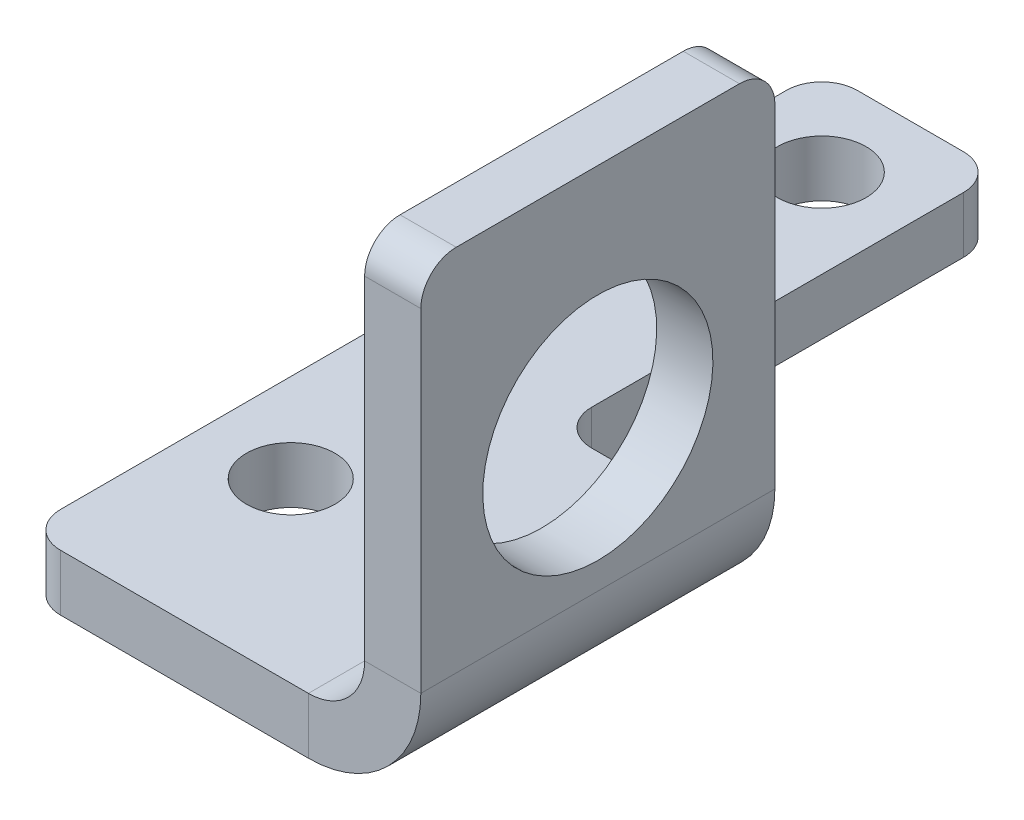
ISO-10303-21;
HEADER;
FILE_DESCRIPTION(('STEP AP214'),'2;1');
FILE_NAME('part.step','',(''),(''),'','','');
FILE_SCHEMA(('AUTOMOTIVE_DESIGN { 1 0 10303 214 1 1 1 1 }'));
ENDSEC;
DATA;
#1=APPLICATION_CONTEXT('core data for automotive mechanical design processes');
#2=APPLICATION_PROTOCOL_DEFINITION('international standard','automotive_design',2000,#1);
#3=PRODUCT_CONTEXT('',#1,'mechanical');
#4=PRODUCT('Part','Part','',(#3));
#5=PRODUCT_RELATED_PRODUCT_CATEGORY('part','',(#4));
#6=PRODUCT_DEFINITION_FORMATION('','',#4);
#7=PRODUCT_DEFINITION_CONTEXT('part definition',#1,'design');
#8=PRODUCT_DEFINITION('design','',#6,#7);
#9=PRODUCT_DEFINITION_SHAPE('','',#8);
#10=(LENGTH_UNIT() NAMED_UNIT(*) SI_UNIT(.MILLI.,.METRE.));
#11=(NAMED_UNIT(*) PLANE_ANGLE_UNIT() SI_UNIT($,.RADIAN.));
#12=(NAMED_UNIT(*) SI_UNIT($,.STERADIAN.) SOLID_ANGLE_UNIT());
#13=UNCERTAINTY_MEASURE_WITH_UNIT(LENGTH_MEASURE(1.E-05),#10,'distance_accuracy_value','');
#14=(GEOMETRIC_REPRESENTATION_CONTEXT(3) GLOBAL_UNCERTAINTY_ASSIGNED_CONTEXT((#13)) GLOBAL_UNIT_ASSIGNED_CONTEXT((#10,
#11,#12)) REPRESENTATION_CONTEXT('',''));
#15=CARTESIAN_POINT('',(0.,0.,0.));
#16=DIRECTION('',(0.,0.,1.));
#17=DIRECTION('',(1.,0.,0.));
#18=AXIS2_PLACEMENT_3D('',#15,#16,#17);
#19=CARTESIAN_POINT('',(10.,3.175,0.));
#20=DIRECTION('',(-1.,0.,0.));
#21=DIRECTION('',(0.,0.,-1.));
#22=AXIS2_PLACEMENT_3D('',#19,#20,#21);
#23=PLANE('',#22);
#24=DIRECTION('',(0.,0.,-1.));
#25=VECTOR('',#24,1.);
#26=CARTESIAN_POINT('',(10.,0.,0.));
#27=LINE('',#26,#25);
#28=CARTESIAN_POINT('',(10.,0.,-22.));
#29=VERTEX_POINT('',#28);
#30=CARTESIAN_POINT('',(10.,0.,-43.));
#31=VERTEX_POINT('',#30);
#32=EDGE_CURVE('E310',#29,#31,#27,.T.);
#33=ORIENTED_EDGE('',*,*,#32,.T.);
#34=DIRECTION('',(0.,-1.,0.));
#35=VECTOR('',#34,1.);
#36=CARTESIAN_POINT('',(10.,3.175,-43.));
#37=LINE('',#36,#35);
#38=CARTESIAN_POINT('',(10.,3.175,-43.));
#39=VERTEX_POINT('',#38);
#40=EDGE_CURVE('E351',#31,#39,#37,.F.);
#41=ORIENTED_EDGE('',*,*,#40,.T.);
#42=DIRECTION('',(0.,0.,-1.));
#43=VECTOR('',#42,1.);
#44=CARTESIAN_POINT('',(10.,3.175,0.));
#45=LINE('',#44,#43);
#46=CARTESIAN_POINT('',(10.,3.175,-22.));
#47=VERTEX_POINT('',#46);
#48=EDGE_CURVE('E286',#47,#39,#45,.T.);
#49=ORIENTED_EDGE('',*,*,#48,.F.);
#50=DIRECTION('',(0.,-1.,0.));
#51=VECTOR('',#50,1.);
#52=CARTESIAN_POINT('',(10.,0.,-22.));
#53=LINE('',#52,#51);
#54=EDGE_CURVE('E347',#47,#29,#53,.T.);
#55=ORIENTED_EDGE('',*,*,#54,.T.);
#56=EDGE_LOOP('',(#33,#41,#49,#55));
#57=FACE_BOUND('',#56,.T.);
#58=ADVANCED_FACE('F68',(#57),#23,.F.);
#59=CARTESIAN_POINT('',(0.,3.175,-45.));
#60=DIRECTION('',(0.,0.,1.));
#61=DIRECTION('',(-1.,0.,0.));
#62=AXIS2_PLACEMENT_3D('',#59,#60,#61);
#63=PLANE('',#62);
#64=DIRECTION('',(1.,0.,0.));
#65=VECTOR('',#64,1.);
#66=CARTESIAN_POINT('',(0.,0.,-45.));
#67=LINE('',#66,#65);
#68=CARTESIAN_POINT('',(8.,0.,-45.));
#69=VERTEX_POINT('',#68);
#70=CARTESIAN_POINT('',(2.,0.,-45.));
#71=VERTEX_POINT('',#70);
#72=EDGE_CURVE('E275',#69,#71,#67,.F.);
#73=ORIENTED_EDGE('',*,*,#72,.T.);
#74=DIRECTION('',(0.,-1.,0.));
#75=VECTOR('',#74,1.);
#76=CARTESIAN_POINT('',(2.,3.175,-45.));
#77=LINE('',#76,#75);
#78=CARTESIAN_POINT('',(2.,3.175,-45.));
#79=VERTEX_POINT('',#78);
#80=EDGE_CURVE('E318',#71,#79,#77,.F.);
#81=ORIENTED_EDGE('',*,*,#80,.T.);
#82=DIRECTION('',(-1.,0.,0.));
#83=VECTOR('',#82,1.);
#84=CARTESIAN_POINT('',(0.,3.175,-45.));
#85=LINE('',#84,#83);
#86=CARTESIAN_POINT('',(8.,3.175,-45.));
#87=VERTEX_POINT('',#86);
#88=EDGE_CURVE('E290',#87,#79,#85,.T.);
#89=ORIENTED_EDGE('',*,*,#88,.F.);
#90=DIRECTION('',(0.,-1.,0.));
#91=VECTOR('',#90,1.);
#92=CARTESIAN_POINT('',(8.,3.175,-45.));
#93=LINE('',#92,#91);
#94=EDGE_CURVE('E294',#87,#69,#93,.T.);
#95=ORIENTED_EDGE('',*,*,#94,.T.);
#96=EDGE_LOOP('',(#73,#81,#89,#95));
#97=FACE_BOUND('',#96,.T.);
#98=ADVANCED_FACE('F409',(#97),#63,.F.);
#99=CARTESIAN_POINT('',(0.,3.175,0.));
#100=DIRECTION('',(1.,0.,0.));
#101=DIRECTION('',(0.,0.,1.));
#102=AXIS2_PLACEMENT_3D('',#99,#100,#101);
#103=PLANE('',#102);
#104=DIRECTION('',(0.,0.,1.));
#105=VECTOR('',#104,1.);
#106=CARTESIAN_POINT('',(0.,3.175,0.));
#107=LINE('',#106,#105);
#108=CARTESIAN_POINT('',(0.,3.175,-43.));
#109=VERTEX_POINT('',#108);
#110=CARTESIAN_POINT('',(0.,3.175,-2.));
#111=VERTEX_POINT('',#110);
#112=EDGE_CURVE('E279',#109,#111,#107,.T.);
#113=ORIENTED_EDGE('',*,*,#112,.F.);
#114=DIRECTION('',(0.,-1.,0.));
#115=VECTOR('',#114,1.);
#116=CARTESIAN_POINT('',(0.,3.175,-43.));
#117=LINE('',#116,#115);
#118=CARTESIAN_POINT('',(0.,0.,-43.));
#119=VERTEX_POINT('',#118);
#120=EDGE_CURVE('E335',#109,#119,#117,.T.);
#121=ORIENTED_EDGE('',*,*,#120,.T.);
#122=DIRECTION('',(0.,0.,-1.));
#123=VECTOR('',#122,1.);
#124=CARTESIAN_POINT('',(0.,0.,0.));
#125=LINE('',#124,#123);
#126=CARTESIAN_POINT('',(0.,0.,-2.));
#127=VERTEX_POINT('',#126);
#128=EDGE_CURVE('E302',#119,#127,#125,.F.);
#129=ORIENTED_EDGE('',*,*,#128,.T.);
#130=DIRECTION('',(0.,-1.,0.));
#131=VECTOR('',#130,1.);
#132=CARTESIAN_POINT('',(0.,3.175,-2.));
#133=LINE('',#132,#131);
#134=EDGE_CURVE('E331',#127,#111,#133,.F.);
#135=ORIENTED_EDGE('',*,*,#134,.T.);
#136=EDGE_LOOP('',(#113,#121,#129,#135));
#137=FACE_BOUND('',#136,.T.);
#138=ADVANCED_FACE('F418',(#137),#103,.F.);
#139=CARTESIAN_POINT('',(5.,3.175,-10.));
#140=DIRECTION('',(0.,-1.,0.));
#141=DIRECTION('',(0.,0.,-1.));
#142=AXIS2_PLACEMENT_3D('',#139,#140,#141);
#143=CYLINDRICAL_SURFACE('',#142,2.5);
#144=CARTESIAN_POINT('',(5.,3.175,-10.));
#145=DIRECTION('',(0.,1.,0.));
#146=DIRECTION('',(0.,0.,1.));
#147=AXIS2_PLACEMENT_3D('',#144,#145,#146);
#148=CIRCLE('',#147,2.5);
#149=CARTESIAN_POINT('',(5.,3.175,-7.5));
#150=VERTEX_POINT('',#149);
#151=EDGE_CURVE('E270',#150,#150,#148,.T.);
#152=ORIENTED_EDGE('',*,*,#151,.T.);
#153=EDGE_LOOP('',(#152));
#154=FACE_BOUND('',#153,.T.);
#155=CARTESIAN_POINT('',(5.,0.,-10.));
#156=DIRECTION('',(0.,1.,0.));
#157=DIRECTION('',(0.,0.,1.));
#158=AXIS2_PLACEMENT_3D('',#155,#156,#157);
#159=CIRCLE('',#158,2.5);
#160=CARTESIAN_POINT('',(5.,0.,-7.5));
#161=VERTEX_POINT('',#160);
#162=EDGE_CURVE('E269',#161,#161,#159,.T.);
#163=ORIENTED_EDGE('',*,*,#162,.F.);
#164=EDGE_LOOP('',(#163));
#165=FACE_BOUND('',#164,.T.);
#166=ADVANCED_FACE('F663',(#154,#165),#143,.F.);
#167=CARTESIAN_POINT('',(5.,3.175,-40.));
#168=DIRECTION('',(0.,-1.,0.));
#169=DIRECTION('',(0.,0.,-1.));
#170=AXIS2_PLACEMENT_3D('',#167,#168,#169);
#171=CYLINDRICAL_SURFACE('',#170,2.5);
#172=CARTESIAN_POINT('',(5.,3.175,-40.));
#173=DIRECTION('',(0.,1.,0.));
#174=DIRECTION('',(0.,0.,1.));
#175=AXIS2_PLACEMENT_3D('',#172,#173,#174);
#176=CIRCLE('',#175,2.5);
#177=CARTESIAN_POINT('',(5.,3.175,-37.5));
#178=VERTEX_POINT('',#177);
#179=EDGE_CURVE('E274',#178,#178,#176,.T.);
#180=ORIENTED_EDGE('',*,*,#179,.T.);
#181=EDGE_LOOP('',(#180));
#182=FACE_BOUND('',#181,.T.);
#183=CARTESIAN_POINT('',(5.,0.,-40.));
#184=DIRECTION('',(0.,1.,0.));
#185=DIRECTION('',(0.,0.,1.));
#186=AXIS2_PLACEMENT_3D('',#183,#184,#185);
#187=CIRCLE('',#186,2.5);
#188=CARTESIAN_POINT('',(5.,0.,-37.5));
#189=VERTEX_POINT('',#188);
#190=EDGE_CURVE('E298',#189,#189,#187,.T.);
#191=ORIENTED_EDGE('',*,*,#190,.F.);
#192=EDGE_LOOP('',(#191));
#193=FACE_BOUND('',#192,.T.);
#194=ADVANCED_FACE('F485',(#182,#193),#171,.F.);
#195=CARTESIAN_POINT('',(0.,3.175,0.));
#196=DIRECTION('',(0.,0.,-1.));
#197=DIRECTION('',(1.,0.,0.));
#198=AXIS2_PLACEMENT_3D('',#195,#196,#197);
#199=PLANE('',#198);
#200=DIRECTION('',(1.,0.,0.));
#201=VECTOR('',#200,1.);
#202=CARTESIAN_POINT('',(0.,3.175,0.));
#203=LINE('',#202,#201);
#204=CARTESIAN_POINT('',(2.,3.175,0.));
#205=VERTEX_POINT('',#204);
#206=CARTESIAN_POINT('',(16.,3.175,0.));
#207=VERTEX_POINT('',#206);
#208=EDGE_CURVE('E283',#205,#207,#203,.T.);
#209=ORIENTED_EDGE('',*,*,#208,.F.);
#210=DIRECTION('',(0.,-1.,0.));
#211=VECTOR('',#210,1.);
#212=CARTESIAN_POINT('',(2.,3.175,0.));
#213=LINE('',#212,#211);
#214=CARTESIAN_POINT('',(2.,0.,0.));
#215=VERTEX_POINT('',#214);
#216=EDGE_CURVE('E382',#205,#215,#213,.T.);
#217=ORIENTED_EDGE('',*,*,#216,.T.);
#218=DIRECTION('',(1.,0.,0.));
#219=VECTOR('',#218,1.);
#220=CARTESIAN_POINT('',(0.,0.,0.));
#221=LINE('',#220,#219);
#222=CARTESIAN_POINT('',(16.,0.,0.));
#223=VERTEX_POINT('',#222);
#224=EDGE_CURVE('E306',#215,#223,#221,.T.);
#225=ORIENTED_EDGE('',*,*,#224,.T.);
#226=DIRECTION('',(0.,-1.,0.));
#227=VECTOR('',#226,1.);
#228=CARTESIAN_POINT('',(16.,3.175,0.));
#229=LINE('',#228,#227);
#230=EDGE_CURVE('E254',#207,#223,#229,.T.);
#231=ORIENTED_EDGE('',*,*,#230,.F.);
#232=EDGE_LOOP('',(#209,#217,#225,#231));
#233=FACE_BOUND('',#232,.T.);
#234=ADVANCED_FACE('F426',(#233),#199,.F.);
#235=CARTESIAN_POINT('',(0.,3.175,0.));
#236=DIRECTION('',(0.,-1.,0.));
#237=DIRECTION('',(0.,0.,-1.));
#238=AXIS2_PLACEMENT_3D('',#235,#236,#237);
#239=PLANE('',#238);
#240=ORIENTED_EDGE('',*,*,#151,.F.);
#241=EDGE_LOOP('',(#240));
#242=FACE_BOUND('',#241,.T.);
#243=ORIENTED_EDGE('',*,*,#179,.F.);
#244=EDGE_LOOP('',(#243));
#245=FACE_BOUND('',#244,.T.);
#246=ORIENTED_EDGE('',*,*,#88,.T.);
#247=CARTESIAN_POINT('',(2.,3.175,-43.));
#248=DIRECTION('',(0.,-1.,0.));
#249=DIRECTION('',(0.,0.,-1.));
#250=AXIS2_PLACEMENT_3D('',#247,#248,#249);
#251=CIRCLE('',#250,2.);
#252=EDGE_CURVE('E328',#79,#109,#251,.F.);
#253=ORIENTED_EDGE('',*,*,#252,.T.);
#254=ORIENTED_EDGE('',*,*,#112,.T.);
#255=CARTESIAN_POINT('',(2.,3.175,-2.));
#256=DIRECTION('',(0.,-1.,0.));
#257=DIRECTION('',(0.,0.,-1.));
#258=AXIS2_PLACEMENT_3D('',#255,#256,#257);
#259=CIRCLE('',#258,2.);
#260=EDGE_CURVE('E322',#111,#205,#259,.F.);
#261=ORIENTED_EDGE('',*,*,#260,.T.);
#262=ORIENTED_EDGE('',*,*,#208,.T.);
#263=DIRECTION('',(0.,0.,-1.));
#264=VECTOR('',#263,1.);
#265=CARTESIAN_POINT('',(16.,3.175,-20.));
#266=LINE('',#265,#264);
#267=CARTESIAN_POINT('',(16.,3.175,-20.));
#268=VERTEX_POINT('',#267);
#269=EDGE_CURVE('E248',#268,#207,#266,.F.);
#270=ORIENTED_EDGE('',*,*,#269,.F.);
#271=DIRECTION('',(-1.,0.,0.));
#272=VECTOR('',#271,1.);
#273=CARTESIAN_POINT('',(16.,3.175,-20.));
#274=LINE('',#273,#272);
#275=CARTESIAN_POINT('',(12.,3.175,-20.));
#276=VERTEX_POINT('',#275);
#277=EDGE_CURVE('E265',#268,#276,#274,.T.);
#278=ORIENTED_EDGE('',*,*,#277,.T.);
#279=CARTESIAN_POINT('',(12.,3.175,-22.));
#280=DIRECTION('',(0.,-1.,0.));
#281=DIRECTION('',(0.,0.,-1.));
#282=AXIS2_PLACEMENT_3D('',#279,#280,#281);
#283=CIRCLE('',#282,2.);
#284=EDGE_CURVE('E13',#276,#47,#283,.T.);
#285=ORIENTED_EDGE('',*,*,#284,.T.);
#286=ORIENTED_EDGE('',*,*,#48,.T.);
#287=CARTESIAN_POINT('',(8.,3.175,-43.));
#288=DIRECTION('',(0.,-1.,0.));
#289=DIRECTION('',(0.,0.,-1.));
#290=AXIS2_PLACEMENT_3D('',#287,#288,#289);
#291=CIRCLE('',#290,2.);
#292=EDGE_CURVE('E325',#39,#87,#291,.F.);
#293=ORIENTED_EDGE('',*,*,#292,.T.);
#294=EDGE_LOOP('',(#246,#253,#254,#261,#262,#270,#278,#285,#286,#293));
#295=FACE_BOUND('',#294,.T.);
#296=ADVANCED_FACE('F399',(#242,#245,#295),#239,.F.);
#297=CARTESIAN_POINT('',(0.,0.,0.));
#298=DIRECTION('',(0.,-1.,0.));
#299=DIRECTION('',(0.,0.,-1.));
#300=AXIS2_PLACEMENT_3D('',#297,#298,#299);
#301=PLANE('',#300);
#302=ORIENTED_EDGE('',*,*,#162,.T.);
#303=EDGE_LOOP('',(#302));
#304=FACE_BOUND('',#303,.T.);
#305=ORIENTED_EDGE('',*,*,#190,.T.);
#306=EDGE_LOOP('',(#305));
#307=FACE_BOUND('',#306,.T.);
#308=ORIENTED_EDGE('',*,*,#128,.F.);
#309=CARTESIAN_POINT('',(2.,0.,-43.));
#310=DIRECTION('',(0.,-1.,0.));
#311=DIRECTION('',(0.,0.,-1.));
#312=AXIS2_PLACEMENT_3D('',#309,#310,#311);
#313=CIRCLE('',#312,2.);
#314=EDGE_CURVE('E344',#119,#71,#313,.T.);
#315=ORIENTED_EDGE('',*,*,#314,.T.);
#316=ORIENTED_EDGE('',*,*,#72,.F.);
#317=CARTESIAN_POINT('',(8.,0.,-43.));
#318=DIRECTION('',(0.,-1.,0.));
#319=DIRECTION('',(0.,0.,-1.));
#320=AXIS2_PLACEMENT_3D('',#317,#318,#319);
#321=CIRCLE('',#320,2.);
#322=EDGE_CURVE('E341',#69,#31,#321,.T.);
#323=ORIENTED_EDGE('',*,*,#322,.T.);
#324=ORIENTED_EDGE('',*,*,#32,.F.);
#325=CARTESIAN_POINT('',(12.,0.,-22.));
#326=DIRECTION('',(0.,-1.,0.));
#327=DIRECTION('',(0.,0.,-1.));
#328=AXIS2_PLACEMENT_3D('',#325,#326,#327);
#329=CIRCLE('',#328,2.);
#330=CARTESIAN_POINT('',(12.,0.,-20.));
#331=VERTEX_POINT('',#330);
#332=EDGE_CURVE('E77',#29,#331,#329,.F.);
#333=ORIENTED_EDGE('',*,*,#332,.T.);
#334=DIRECTION('',(-1.,0.,0.));
#335=VECTOR('',#334,1.);
#336=CARTESIAN_POINT('',(16.,0.,-20.));
#337=LINE('',#336,#335);
#338=CARTESIAN_POINT('',(16.,0.,-20.));
#339=VERTEX_POINT('',#338);
#340=EDGE_CURVE('E258',#339,#331,#337,.T.);
#341=ORIENTED_EDGE('',*,*,#340,.F.);
#342=DIRECTION('',(0.,0.,-1.));
#343=VECTOR('',#342,1.);
#344=CARTESIAN_POINT('',(16.,0.,-20.));
#345=LINE('',#344,#343);
#346=EDGE_CURVE('E192',#339,#223,#345,.F.);
#347=ORIENTED_EDGE('',*,*,#346,.T.);
#348=ORIENTED_EDGE('',*,*,#224,.F.);
#349=CARTESIAN_POINT('',(2.,0.,-2.));
#350=DIRECTION('',(0.,-1.,0.));
#351=DIRECTION('',(0.,0.,-1.));
#352=AXIS2_PLACEMENT_3D('',#349,#350,#351);
#353=CIRCLE('',#352,2.);
#354=EDGE_CURVE('E338',#215,#127,#353,.T.);
#355=ORIENTED_EDGE('',*,*,#354,.T.);
#356=EDGE_LOOP('',(#308,#315,#316,#323,#324,#333,#341,#347,#348,#355));
#357=FACE_BOUND('',#356,.T.);
#358=ADVANCED_FACE('F388',(#304,#307,#357),#301,.T.);
#359=CARTESIAN_POINT('',(16.,3.175,-20.));
#360=DIRECTION('',(0.,0.,-1.));
#361=DIRECTION('',(0.,-1.,0.));
#362=AXIS2_PLACEMENT_3D('',#359,#360,#361);
#363=PLANE('',#362);
#364=ORIENTED_EDGE('',*,*,#340,.T.);
#365=DIRECTION('',(0.,1.,0.));
#366=VECTOR('',#365,1.);
#367=CARTESIAN_POINT('',(12.,3.175,-20.));
#368=LINE('',#367,#366);
#369=EDGE_CURVE('E355',#331,#276,#368,.T.);
#370=ORIENTED_EDGE('',*,*,#369,.T.);
#371=ORIENTED_EDGE('',*,*,#277,.F.);
#372=DIRECTION('',(0.,-1.,0.));
#373=VECTOR('',#372,1.);
#374=CARTESIAN_POINT('',(16.,3.175,-20.));
#375=LINE('',#374,#373);
#376=EDGE_CURVE('E243',#268,#339,#375,.T.);
#377=ORIENTED_EDGE('',*,*,#376,.T.);
#378=EDGE_LOOP('',(#364,#370,#371,#377));
#379=FACE_BOUND('',#378,.T.);
#380=ADVANCED_FACE('F393',(#379),#363,.T.);
#381=CARTESIAN_POINT('',(16.,6.35,0.));
#382=DIRECTION('',(0.,0.,1.));
#383=DIRECTION('',(0.,-1.,0.));
#384=AXIS2_PLACEMENT_3D('',#381,#382,#383);
#385=PLANE('',#384);
#386=DIRECTION('',(-1.,0.,0.));
#387=VECTOR('',#386,1.);
#388=CARTESIAN_POINT('',(22.35,6.34999999999998,0.));
#389=LINE('',#388,#387);
#390=CARTESIAN_POINT('',(19.175,6.34999999999999,0.));
#391=VERTEX_POINT('',#390);
#392=CARTESIAN_POINT('',(22.35,6.34999999999997,0.));
#393=VERTEX_POINT('',#392);
#394=EDGE_CURVE('E234',#391,#393,#389,.F.);
#395=ORIENTED_EDGE('',*,*,#394,.F.);
#396=CARTESIAN_POINT('',(16.,6.35,0.));
#397=DIRECTION('',(0.,0.,-1.));
#398=DIRECTION('',(0.,1.,0.));
#399=AXIS2_PLACEMENT_3D('',#396,#397,#398);
#400=CIRCLE('',#399,3.175);
#401=EDGE_CURVE('E196',#207,#391,#400,.F.);
#402=ORIENTED_EDGE('',*,*,#401,.F.);
#403=ORIENTED_EDGE('',*,*,#230,.T.);
#404=CARTESIAN_POINT('',(16.,6.35,0.));
#405=DIRECTION('',(0.,0.,-1.));
#406=DIRECTION('',(0.,1.,0.));
#407=AXIS2_PLACEMENT_3D('',#404,#405,#406);
#408=CIRCLE('',#407,6.35);
#409=EDGE_CURVE('E241',#223,#393,#408,.F.);
#410=ORIENTED_EDGE('',*,*,#409,.T.);
#411=EDGE_LOOP('',(#395,#402,#403,#410));
#412=FACE_BOUND('',#411,.T.);
#413=ADVANCED_FACE('F431',(#412),#385,.T.);
#414=CARTESIAN_POINT('',(16.,6.35,-20.));
#415=DIRECTION('',(0.,0.,1.));
#416=DIRECTION('',(0.,-1.,0.));
#417=AXIS2_PLACEMENT_3D('',#414,#415,#416);
#418=PLANE('',#417);
#419=CARTESIAN_POINT('',(16.,6.35,-20.));
#420=DIRECTION('',(0.,0.,-1.));
#421=DIRECTION('',(0.,1.,0.));
#422=AXIS2_PLACEMENT_3D('',#419,#420,#421);
#423=CIRCLE('',#422,3.175);
#424=CARTESIAN_POINT('',(19.175,6.34999999999999,-20.));
#425=VERTEX_POINT('',#424);
#426=EDGE_CURVE('E203',#425,#268,#423,.T.);
#427=ORIENTED_EDGE('',*,*,#426,.F.);
#428=DIRECTION('',(-1.,0.,0.));
#429=VECTOR('',#428,1.);
#430=CARTESIAN_POINT('',(19.175,6.34999999999999,-20.));
#431=LINE('',#430,#429);
#432=CARTESIAN_POINT('',(22.35,6.34999999999998,-20.));
#433=VERTEX_POINT('',#432);
#434=EDGE_CURVE('E200',#425,#433,#431,.F.);
#435=ORIENTED_EDGE('',*,*,#434,.T.);
#436=CARTESIAN_POINT('',(16.,6.35,-20.));
#437=DIRECTION('',(0.,0.,-1.));
#438=DIRECTION('',(0.,1.,0.));
#439=AXIS2_PLACEMENT_3D('',#436,#437,#438);
#440=CIRCLE('',#439,6.35);
#441=EDGE_CURVE('E184',#433,#339,#440,.T.);
#442=ORIENTED_EDGE('',*,*,#441,.T.);
#443=ORIENTED_EDGE('',*,*,#376,.F.);
#444=EDGE_LOOP('',(#427,#435,#442,#443));
#445=FACE_BOUND('',#444,.T.);
#446=ADVANCED_FACE('F201',(#445),#418,.F.);
#447=CARTESIAN_POINT('',(16.,6.35,-20.));
#448=DIRECTION('',(0.,0.,-1.));
#449=DIRECTION('',(1.,0.,0.));
#450=AXIS2_PLACEMENT_3D('',#447,#448,#449);
#451=CYLINDRICAL_SURFACE('',#450,6.35);
#452=ORIENTED_EDGE('',*,*,#346,.F.);
#453=ORIENTED_EDGE('',*,*,#441,.F.);
#454=DIRECTION('',(0.,0.,-1.));
#455=VECTOR('',#454,1.);
#456=CARTESIAN_POINT('',(22.35,6.34999999999998,0.));
#457=LINE('',#456,#455);
#458=EDGE_CURVE('E189',#433,#393,#457,.F.);
#459=ORIENTED_EDGE('',*,*,#458,.T.);
#460=ORIENTED_EDGE('',*,*,#409,.F.);
#461=EDGE_LOOP('',(#452,#453,#459,#460));
#462=FACE_BOUND('',#461,.T.);
#463=ADVANCED_FACE('F186',(#462),#451,.T.);
#464=CARTESIAN_POINT('',(16.,6.35,-20.));
#465=DIRECTION('',(0.,0.,-1.));
#466=DIRECTION('',(1.,0.,0.));
#467=AXIS2_PLACEMENT_3D('',#464,#465,#466);
#468=CYLINDRICAL_SURFACE('',#467,3.175);
#469=ORIENTED_EDGE('',*,*,#269,.T.);
#470=ORIENTED_EDGE('',*,*,#401,.T.);
#471=DIRECTION('',(0.,0.,-1.));
#472=VECTOR('',#471,1.);
#473=CARTESIAN_POINT('',(19.175,6.34999999999999,0.));
#474=LINE('',#473,#472);
#475=EDGE_CURVE('E206',#391,#425,#474,.T.);
#476=ORIENTED_EDGE('',*,*,#475,.T.);
#477=ORIENTED_EDGE('',*,*,#426,.T.);
#478=EDGE_LOOP('',(#469,#470,#476,#477));
#479=FACE_BOUND('',#478,.T.);
#480=ADVANCED_FACE('F434',(#479),#468,.F.);
#481=CARTESIAN_POINT('',(22.3500000000001,27.175,-20.));
#482=DIRECTION('',(0.,0.,1.));
#483=DIRECTION('',(0.,-1.,0.));
#484=AXIS2_PLACEMENT_3D('',#481,#482,#483);
#485=PLANE('',#484);
#486=DIRECTION('',(0.,-1.,0.));
#487=VECTOR('',#486,1.);
#488=CARTESIAN_POINT('',(19.1750000000001,27.175,-20.));
#489=LINE('',#488,#487);
#490=CARTESIAN_POINT('',(19.1750000000001,25.175,-20.));
#491=VERTEX_POINT('',#490);
#492=EDGE_CURVE('E213',#425,#491,#489,.F.);
#493=ORIENTED_EDGE('',*,*,#492,.T.);
#494=DIRECTION('',(-1.,0.,0.));
#495=VECTOR('',#494,1.);
#496=CARTESIAN_POINT('',(22.3500000000001,25.175,-20.));
#497=LINE('',#496,#495);
#498=CARTESIAN_POINT('',(22.3500000000001,25.175,-20.));
#499=VERTEX_POINT('',#498);
#500=EDGE_CURVE('E92',#491,#499,#497,.F.);
#501=ORIENTED_EDGE('',*,*,#500,.T.);
#502=DIRECTION('',(0.,1.,0.));
#503=VECTOR('',#502,1.);
#504=CARTESIAN_POINT('',(22.35,0.,-20.));
#505=LINE('',#504,#503);
#506=EDGE_CURVE('E209',#433,#499,#505,.T.);
#507=ORIENTED_EDGE('',*,*,#506,.F.);
#508=ORIENTED_EDGE('',*,*,#434,.F.);
#509=EDGE_LOOP('',(#493,#501,#507,#508));
#510=FACE_BOUND('',#509,.T.);
#511=ADVANCED_FACE('F215',(#510),#485,.F.);
#512=CARTESIAN_POINT('',(22.35,3.17499999999999,0.));
#513=DIRECTION('',(0.,0.,-1.));
#514=DIRECTION('',(-1.,0.,0.));
#515=AXIS2_PLACEMENT_3D('',#512,#513,#514);
#516=PLANE('',#515);
#517=DIRECTION('',(0.,-1.,0.));
#518=VECTOR('',#517,1.);
#519=CARTESIAN_POINT('',(22.35,0.,0.));
#520=LINE('',#519,#518);
#521=CARTESIAN_POINT('',(22.3500000000001,25.175,0.));
#522=VERTEX_POINT('',#521);
#523=EDGE_CURVE('E211',#522,#393,#520,.T.);
#524=ORIENTED_EDGE('',*,*,#523,.F.);
#525=DIRECTION('',(-1.,0.,0.));
#526=VECTOR('',#525,1.);
#527=CARTESIAN_POINT('',(22.3500000000001,25.175,0.));
#528=LINE('',#527,#526);
#529=CARTESIAN_POINT('',(19.1750000000001,25.175,0.));
#530=VERTEX_POINT('',#529);
#531=EDGE_CURVE('E378',#522,#530,#528,.T.);
#532=ORIENTED_EDGE('',*,*,#531,.T.);
#533=DIRECTION('',(0.,1.,0.));
#534=VECTOR('',#533,1.);
#535=CARTESIAN_POINT('',(19.175,3.175,0.));
#536=LINE('',#535,#534);
#537=EDGE_CURVE('E218',#530,#391,#536,.F.);
#538=ORIENTED_EDGE('',*,*,#537,.T.);
#539=ORIENTED_EDGE('',*,*,#394,.T.);
#540=EDGE_LOOP('',(#524,#532,#538,#539));
#541=FACE_BOUND('',#540,.T.);
#542=ADVANCED_FACE('F450',(#541),#516,.F.);
#543=CARTESIAN_POINT('',(22.35,0.,0.));
#544=DIRECTION('',(-1.,0.,0.));
#545=DIRECTION('',(0.,-1.,0.));
#546=AXIS2_PLACEMENT_3D('',#543,#544,#545);
#547=PLANE('',#546);
#548=CARTESIAN_POINT('',(22.35,14.3499999999999,-10.));
#549=DIRECTION('',(-1.,0.,0.));
#550=DIRECTION('',(0.,-1.,0.));
#551=AXIS2_PLACEMENT_3D('',#548,#549,#550);
#552=CIRCLE('',#551,6.5);
#553=CARTESIAN_POINT('',(22.35,7.84999999999992,-10.));
#554=VERTEX_POINT('',#553);
#555=EDGE_CURVE('E238',#554,#554,#552,.F.);
#556=ORIENTED_EDGE('',*,*,#555,.F.);
#557=EDGE_LOOP('',(#556));
#558=FACE_BOUND('',#557,.T.);
#559=ORIENTED_EDGE('',*,*,#506,.T.);
#560=CARTESIAN_POINT('',(22.3500000000001,25.175,-18.));
#561=DIRECTION('',(-1.,0.,0.));
#562=DIRECTION('',(0.,-1.,0.));
#563=AXIS2_PLACEMENT_3D('',#560,#561,#562);
#564=CIRCLE('',#563,2.);
#565=CARTESIAN_POINT('',(22.3500000000001,27.175,-18.));
#566=VERTEX_POINT('',#565);
#567=EDGE_CURVE('E375',#499,#566,#564,.F.);
#568=ORIENTED_EDGE('',*,*,#567,.T.);
#569=DIRECTION('',(0.,0.,1.));
#570=VECTOR('',#569,1.);
#571=CARTESIAN_POINT('',(22.3500000000001,27.175,0.));
#572=LINE('',#571,#570);
#573=CARTESIAN_POINT('',(22.3500000000001,27.175,-2.));
#574=VERTEX_POINT('',#573);
#575=EDGE_CURVE('E217',#566,#574,#572,.T.);
#576=ORIENTED_EDGE('',*,*,#575,.T.);
#577=CARTESIAN_POINT('',(22.3500000000001,25.175,-2.));
#578=DIRECTION('',(-1.,0.,0.));
#579=DIRECTION('',(0.,-1.,0.));
#580=AXIS2_PLACEMENT_3D('',#577,#578,#579);
#581=CIRCLE('',#580,2.);
#582=EDGE_CURVE('E84',#574,#522,#581,.F.);
#583=ORIENTED_EDGE('',*,*,#582,.T.);
#584=ORIENTED_EDGE('',*,*,#523,.T.);
#585=ORIENTED_EDGE('',*,*,#458,.F.);
#586=EDGE_LOOP('',(#559,#568,#576,#583,#584,#585));
#587=FACE_BOUND('',#586,.T.);
#588=ADVANCED_FACE('F208',(#558,#587),#547,.F.);
#589=CARTESIAN_POINT('',(19.175,0.,0.));
#590=DIRECTION('',(-1.,0.,0.));
#591=DIRECTION('',(0.,-1.,0.));
#592=AXIS2_PLACEMENT_3D('',#589,#590,#591);
#593=PLANE('',#592);
#594=CARTESIAN_POINT('',(19.175,14.3499999999999,-10.));
#595=DIRECTION('',(-1.,0.,0.));
#596=DIRECTION('',(0.,-1.,0.));
#597=AXIS2_PLACEMENT_3D('',#594,#595,#596);
#598=CIRCLE('',#597,6.5);
#599=CARTESIAN_POINT('',(19.175,7.84999999999993,-10.));
#600=VERTEX_POINT('',#599);
#601=EDGE_CURVE('E456',#600,#600,#598,.T.);
#602=ORIENTED_EDGE('',*,*,#601,.F.);
#603=EDGE_LOOP('',(#602));
#604=FACE_BOUND('',#603,.T.);
#605=DIRECTION('',(0.,0.,-1.));
#606=VECTOR('',#605,1.);
#607=CARTESIAN_POINT('',(19.1750000000001,27.175,0.));
#608=LINE('',#607,#606);
#609=CARTESIAN_POINT('',(19.1750000000001,27.175,-18.));
#610=VERTEX_POINT('',#609);
#611=CARTESIAN_POINT('',(19.1750000000001,27.175,-2.));
#612=VERTEX_POINT('',#611);
#613=EDGE_CURVE('E223',#610,#612,#608,.F.);
#614=ORIENTED_EDGE('',*,*,#613,.F.);
#615=CARTESIAN_POINT('',(19.1750000000001,25.175,-18.));
#616=DIRECTION('',(-1.,0.,0.));
#617=DIRECTION('',(0.,-1.,0.));
#618=AXIS2_PLACEMENT_3D('',#615,#616,#617);
#619=CIRCLE('',#618,2.);
#620=EDGE_CURVE('E368',#610,#491,#619,.T.);
#621=ORIENTED_EDGE('',*,*,#620,.T.);
#622=ORIENTED_EDGE('',*,*,#492,.F.);
#623=ORIENTED_EDGE('',*,*,#475,.F.);
#624=ORIENTED_EDGE('',*,*,#537,.F.);
#625=CARTESIAN_POINT('',(19.1750000000001,25.175,-2.));
#626=DIRECTION('',(-1.,0.,0.));
#627=DIRECTION('',(0.,-1.,0.));
#628=AXIS2_PLACEMENT_3D('',#625,#626,#627);
#629=CIRCLE('',#628,2.);
#630=EDGE_CURVE('E365',#530,#612,#629,.T.);
#631=ORIENTED_EDGE('',*,*,#630,.T.);
#632=EDGE_LOOP('',(#614,#621,#622,#623,#624,#631));
#633=FACE_BOUND('',#632,.T.);
#634=ADVANCED_FACE('F438',(#604,#633),#593,.T.);
#635=CARTESIAN_POINT('',(22.3500000000001,27.175,0.));
#636=DIRECTION('',(0.,-1.,0.));
#637=DIRECTION('',(1.,0.,0.));
#638=AXIS2_PLACEMENT_3D('',#635,#636,#637);
#639=PLANE('',#638);
#640=ORIENTED_EDGE('',*,*,#575,.F.);
#641=DIRECTION('',(-1.,0.,0.));
#642=VECTOR('',#641,1.);
#643=CARTESIAN_POINT('',(22.3500000000001,27.175,-18.));
#644=LINE('',#643,#642);
#645=EDGE_CURVE('E361',#566,#610,#644,.T.);
#646=ORIENTED_EDGE('',*,*,#645,.T.);
#647=ORIENTED_EDGE('',*,*,#613,.T.);
#648=DIRECTION('',(-1.,0.,0.));
#649=VECTOR('',#648,1.);
#650=CARTESIAN_POINT('',(22.3500000000001,27.175,-2.));
#651=LINE('',#650,#649);
#652=EDGE_CURVE('E358',#612,#574,#651,.F.);
#653=ORIENTED_EDGE('',*,*,#652,.T.);
#654=EDGE_LOOP('',(#640,#646,#647,#653));
#655=FACE_BOUND('',#654,.T.);
#656=ADVANCED_FACE('F444',(#655),#639,.F.);
#657=CARTESIAN_POINT('',(22.3510000000001,14.3499999999999,-10.));
#658=DIRECTION('',(-1.,0.,0.));
#659=DIRECTION('',(0.,-1.,0.));
#660=AXIS2_PLACEMENT_3D('',#657,#658,#659);
#661=CYLINDRICAL_SURFACE('',#660,6.5);
#662=ORIENTED_EDGE('',*,*,#601,.T.);
#663=EDGE_LOOP('',(#662));
#664=FACE_BOUND('',#663,.T.);
#665=ORIENTED_EDGE('',*,*,#555,.T.);
#666=EDGE_LOOP('',(#665));
#667=FACE_BOUND('',#666,.T.);
#668=ADVANCED_FACE('F461',(#664,#667),#661,.F.);
#669=CARTESIAN_POINT('',(2.,3.175,-43.));
#670=DIRECTION('',(0.,1.,0.));
#671=DIRECTION('',(0.,0.,1.));
#672=AXIS2_PLACEMENT_3D('',#669,#670,#671);
#673=CYLINDRICAL_SURFACE('',#672,2.);
#674=ORIENTED_EDGE('',*,*,#314,.F.);
#675=ORIENTED_EDGE('',*,*,#120,.F.);
#676=ORIENTED_EDGE('',*,*,#252,.F.);
#677=ORIENTED_EDGE('',*,*,#80,.F.);
#678=EDGE_LOOP('',(#674,#675,#676,#677));
#679=FACE_BOUND('',#678,.T.);
#680=ADVANCED_FACE('F414',(#679),#673,.T.);
#681=CARTESIAN_POINT('',(8.,3.175,-43.));
#682=DIRECTION('',(0.,1.,0.));
#683=DIRECTION('',(0.,0.,1.));
#684=AXIS2_PLACEMENT_3D('',#681,#682,#683);
#685=CYLINDRICAL_SURFACE('',#684,2.);
#686=ORIENTED_EDGE('',*,*,#322,.F.);
#687=ORIENTED_EDGE('',*,*,#94,.F.);
#688=ORIENTED_EDGE('',*,*,#292,.F.);
#689=ORIENTED_EDGE('',*,*,#40,.F.);
#690=EDGE_LOOP('',(#686,#687,#688,#689));
#691=FACE_BOUND('',#690,.T.);
#692=ADVANCED_FACE('F405',(#691),#685,.T.);
#693=CARTESIAN_POINT('',(12.,3.175,-22.));
#694=DIRECTION('',(0.,-1.,0.));
#695=DIRECTION('',(0.,0.,-1.));
#696=AXIS2_PLACEMENT_3D('',#693,#694,#695);
#697=CYLINDRICAL_SURFACE('',#696,2.);
#698=ORIENTED_EDGE('',*,*,#284,.F.);
#699=ORIENTED_EDGE('',*,*,#369,.F.);
#700=ORIENTED_EDGE('',*,*,#332,.F.);
#701=ORIENTED_EDGE('',*,*,#54,.F.);
#702=EDGE_LOOP('',(#698,#699,#700,#701));
#703=FACE_BOUND('',#702,.T.);
#704=ADVANCED_FACE('F396',(#703),#697,.F.);
#705=CARTESIAN_POINT('',(22.3500000000001,25.175,-18.));
#706=DIRECTION('',(-1.,0.,0.));
#707=DIRECTION('',(0.,-1.,0.));
#708=AXIS2_PLACEMENT_3D('',#705,#706,#707);
#709=CYLINDRICAL_SURFACE('',#708,2.);
#710=ORIENTED_EDGE('',*,*,#567,.F.);
#711=ORIENTED_EDGE('',*,*,#500,.F.);
#712=ORIENTED_EDGE('',*,*,#620,.F.);
#713=ORIENTED_EDGE('',*,*,#645,.F.);
#714=EDGE_LOOP('',(#710,#711,#712,#713));
#715=FACE_BOUND('',#714,.T.);
#716=ADVANCED_FACE('F440',(#715),#709,.T.);
#717=CARTESIAN_POINT('',(22.3500000000001,25.175,-2.));
#718=DIRECTION('',(-1.,0.,0.));
#719=DIRECTION('',(0.,-1.,0.));
#720=AXIS2_PLACEMENT_3D('',#717,#718,#719);
#721=CYLINDRICAL_SURFACE('',#720,2.);
#722=ORIENTED_EDGE('',*,*,#582,.F.);
#723=ORIENTED_EDGE('',*,*,#652,.F.);
#724=ORIENTED_EDGE('',*,*,#630,.F.);
#725=ORIENTED_EDGE('',*,*,#531,.F.);
#726=EDGE_LOOP('',(#722,#723,#724,#725));
#727=FACE_BOUND('',#726,.T.);
#728=ADVANCED_FACE('F447',(#727),#721,.T.);
#729=CARTESIAN_POINT('',(2.,3.175,-2.));
#730=DIRECTION('',(0.,1.,0.));
#731=DIRECTION('',(0.,0.,1.));
#732=AXIS2_PLACEMENT_3D('',#729,#730,#731);
#733=CYLINDRICAL_SURFACE('',#732,2.);
#734=ORIENTED_EDGE('',*,*,#354,.F.);
#735=ORIENTED_EDGE('',*,*,#216,.F.);
#736=ORIENTED_EDGE('',*,*,#260,.F.);
#737=ORIENTED_EDGE('',*,*,#134,.F.);
#738=EDGE_LOOP('',(#734,#735,#736,#737));
#739=FACE_BOUND('',#738,.T.);
#740=ADVANCED_FACE('F70',(#739),#733,.T.);
#741=CLOSED_SHELL('',(#58,#98,#138,#166,#194,#234,#296,#358,#380,#413,#446,#463,#480,#511,#542,
#588,#634,#656,#668,#680,#692,#704,#716,#728,#740));
#742=MANIFOLD_SOLID_BREP('B2',#741);
#743=ADVANCED_BREP_SHAPE_REPRESENTATION('',(#18,#742),#14);
#744=SHAPE_DEFINITION_REPRESENTATION(#9,#743);
ENDSEC;
END-ISO-10303-21;
